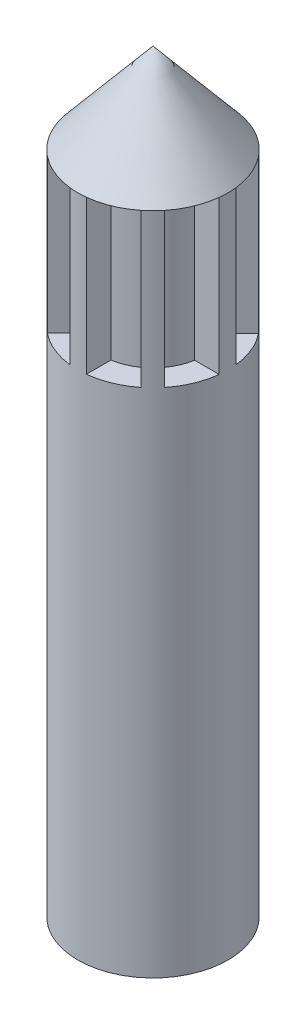
ISO-10303-21;
HEADER;
FILE_DESCRIPTION(('STEP AP214'),'2;1');
FILE_NAME('part.step','',(''),(''),'','','');
FILE_SCHEMA(('AUTOMOTIVE_DESIGN { 1 0 10303 214 1 1 1 1 }'));
ENDSEC;
DATA;
#1=APPLICATION_CONTEXT('core data for automotive mechanical design processes');
#2=APPLICATION_PROTOCOL_DEFINITION('international standard','automotive_design',2000,#1);
#3=PRODUCT_CONTEXT('',#1,'mechanical');
#4=PRODUCT('Part','Part','',(#3));
#5=PRODUCT_RELATED_PRODUCT_CATEGORY('part','',(#4));
#6=PRODUCT_DEFINITION_FORMATION('','',#4);
#7=PRODUCT_DEFINITION_CONTEXT('part definition',#1,'design');
#8=PRODUCT_DEFINITION('design','',#6,#7);
#9=PRODUCT_DEFINITION_SHAPE('','',#8);
#10=(LENGTH_UNIT() NAMED_UNIT(*) SI_UNIT(.MILLI.,.METRE.));
#11=(NAMED_UNIT(*) PLANE_ANGLE_UNIT() SI_UNIT($,.RADIAN.));
#12=(NAMED_UNIT(*) SI_UNIT($,.STERADIAN.) SOLID_ANGLE_UNIT());
#13=UNCERTAINTY_MEASURE_WITH_UNIT(LENGTH_MEASURE(1.E-05),#10,'distance_accuracy_value','');
#14=(GEOMETRIC_REPRESENTATION_CONTEXT(3) GLOBAL_UNCERTAINTY_ASSIGNED_CONTEXT((#13)) GLOBAL_UNIT_ASSIGNED_CONTEXT((#10,
#11,#12)) REPRESENTATION_CONTEXT('',''));
#15=CARTESIAN_POINT('',(0.,0.,0.));
#16=DIRECTION('',(0.,0.,1.));
#17=DIRECTION('',(1.,0.,0.));
#18=AXIS2_PLACEMENT_3D('',#15,#16,#17);
#19=CARTESIAN_POINT('',(0.375265840517225,7.5,0.));
#20=DIRECTION('',(0.,-1.,0.));
#21=DIRECTION('',(0.,0.,-1.));
#22=AXIS2_PLACEMENT_3D('',#19,#20,#21);
#23=CYLINDRICAL_SURFACE('',#22,4.96884550887098);
#24=CARTESIAN_POINT('',(0.375265840517225,-7.5,0.));
#25=DIRECTION('',(0.,1.,0.));
#26=DIRECTION('',(0.,0.,1.));
#27=AXIS2_PLACEMENT_3D('',#24,#25,#26);
#28=CIRCLE('',#27,4.96884550887098);
#29=CARTESIAN_POINT('',(1.16634573988688,-7.5,4.90546820230655));
#30=VERTEX_POINT('',#29);
#31=CARTESIAN_POINT('',(3.25724016380198,-7.5,4.04767213234406));
#32=VERTEX_POINT('',#31);
#33=EDGE_CURVE('E282',#30,#32,#28,.T.);
#34=ORIENTED_EDGE('',*,*,#33,.T.);
#35=DIRECTION('',(0.,-1.,0.));
#36=VECTOR('',#35,1.);
#37=CARTESIAN_POINT('',(3.25724016380191,7.5,4.04767213234396));
#38=LINE('',#37,#36);
#39=CARTESIAN_POINT('',(3.25724016380191,7.5,4.04767213234396));
#40=VERTEX_POINT('',#39);
#41=EDGE_CURVE('E11',#40,#32,#38,.T.);
#42=ORIENTED_EDGE('',*,*,#41,.F.);
#43=CARTESIAN_POINT('',(0.375265840517225,7.5,0.));
#44=DIRECTION('',(0.,1.,0.));
#45=DIRECTION('',(0.,0.,1.));
#46=AXIS2_PLACEMENT_3D('',#43,#44,#45);
#47=CIRCLE('',#46,4.96884550887098);
#48=CARTESIAN_POINT('',(1.16634573988688,7.5,4.90546820230655));
#49=VERTEX_POINT('',#48);
#50=EDGE_CURVE('E346',#49,#40,#47,.T.);
#51=ORIENTED_EDGE('',*,*,#50,.F.);
#52=DIRECTION('',(0.,-1.,0.));
#53=VECTOR('',#52,1.);
#54=CARTESIAN_POINT('',(1.16634573988688,7.5,4.90546820230655));
#55=LINE('',#54,#53);
#56=EDGE_CURVE('E62',#49,#30,#55,.T.);
#57=ORIENTED_EDGE('',*,*,#56,.T.);
#58=EDGE_LOOP('',(#34,#42,#51,#57));
#59=FACE_BOUND('',#58,.T.);
#60=ADVANCED_FACE('F45',(#59),#23,.T.);
#61=CARTESIAN_POINT('',(-0.395215984271011,7.5,0.395215984271011));
#62=DIRECTION('',(-0.707106781186547,0.,0.707106781186548));
#63=DIRECTION('',(0.707106781186548,0.,0.707106781186547));
#64=AXIS2_PLACEMENT_3D('',#61,#62,#63);
#65=PLANE('',#64);
#66=DIRECTION('',(-0.707106781186548,0.,-0.707106781186547));
#67=VECTOR('',#66,1.);
#68=CARTESIAN_POINT('',(-0.395215984271011,-7.5,0.395215984271011));
#69=LINE('',#68,#67);
#70=CARTESIAN_POINT('',(4.95686629235549,-7.5,5.7472982608975));
#71=VERTEX_POINT('',#70);
#72=EDGE_CURVE('E258',#71,#32,#69,.T.);
#73=ORIENTED_EDGE('',*,*,#72,.F.);
#74=DIRECTION('',(0.,-1.,0.));
#75=VECTOR('',#74,1.);
#76=CARTESIAN_POINT('',(4.95686629235556,7.5,5.74729826089758));
#77=LINE('',#76,#75);
#78=CARTESIAN_POINT('',(4.95686629235556,7.5,5.74729826089758));
#79=VERTEX_POINT('',#78);
#80=EDGE_CURVE('E55',#79,#71,#77,.T.);
#81=ORIENTED_EDGE('',*,*,#80,.F.);
#82=DIRECTION('',(-0.707106781186548,0.,-0.707106781186547));
#83=VECTOR('',#82,1.);
#84=CARTESIAN_POINT('',(-0.395215984271011,7.5,0.395215984271011));
#85=LINE('',#84,#83);
#86=EDGE_CURVE('E486',#79,#40,#85,.T.);
#87=ORIENTED_EDGE('',*,*,#86,.T.);
#88=ORIENTED_EDGE('',*,*,#41,.T.);
#89=EDGE_LOOP('',(#73,#81,#87,#88));
#90=FACE_BOUND('',#89,.T.);
#91=ADVANCED_FACE('F47',(#90),#65,.T.);
#92=CARTESIAN_POINT('',(0.747010881563202,7.5,-0.747010881563202));
#93=DIRECTION('',(-0.707106781186547,0.,0.707106781186547));
#94=DIRECTION('',(0.707106781186548,0.,0.707106781186548));
#95=AXIS2_PLACEMENT_3D('',#92,#93,#94);
#96=PLANE('',#95);
#97=DIRECTION('',(-0.707106781186548,0.,-0.707106781186548));
#98=VECTOR('',#97,1.);
#99=CARTESIAN_POINT('',(0.747010881563202,-7.5,-0.747010881563202));
#100=LINE('',#99,#98);
#101=CARTESIAN_POINT('',(6.10168805326835,-7.5,4.60766629014195));
#102=VERTEX_POINT('',#101);
#103=CARTESIAN_POINT('',(4.40333363256777,-7.5,2.90931186944136));
#104=VERTEX_POINT('',#103);
#105=EDGE_CURVE('E281',#102,#104,#100,.T.);
#106=ORIENTED_EDGE('',*,*,#105,.T.);
#107=DIRECTION('',(0.,-1.,0.));
#108=VECTOR('',#107,1.);
#109=CARTESIAN_POINT('',(4.40333363256777,7.5,2.90931186944136));
#110=LINE('',#109,#108);
#111=CARTESIAN_POINT('',(4.40333363256777,7.5,2.90931186944136));
#112=VERTEX_POINT('',#111);
#113=EDGE_CURVE('E456',#112,#104,#110,.T.);
#114=ORIENTED_EDGE('',*,*,#113,.F.);
#115=DIRECTION('',(-0.707106781186548,0.,-0.707106781186548));
#116=VECTOR('',#115,1.);
#117=CARTESIAN_POINT('',(0.747010881563202,7.5,-0.747010881563202));
#118=LINE('',#117,#116);
#119=CARTESIAN_POINT('',(6.10168805326857,7.5,4.60766629014217));
#120=VERTEX_POINT('',#119);
#121=EDGE_CURVE('E466',#120,#112,#118,.T.);
#122=ORIENTED_EDGE('',*,*,#121,.F.);
#123=DIRECTION('',(0.,-1.,0.));
#124=VECTOR('',#123,1.);
#125=CARTESIAN_POINT('',(6.10168805326857,7.5,4.60766629014217));
#126=LINE('',#125,#124);
#127=EDGE_CURVE('E278',#120,#102,#126,.T.);
#128=ORIENTED_EDGE('',*,*,#127,.T.);
#129=EDGE_LOOP('',(#106,#114,#122,#128));
#130=FACE_BOUND('',#129,.T.);
#131=ADVANCED_FACE('F464',(#130),#96,.F.);
#132=CARTESIAN_POINT('',(5.27526584051764,-7.5,0.824272825600417));
#133=VERTEX_POINT('',#132);
#134=EDGE_CURVE('E287',#104,#133,#28,.T.);
#135=ORIENTED_EDGE('',*,*,#134,.T.);
#136=DIRECTION('',(0.,-1.,0.));
#137=VECTOR('',#136,1.);
#138=CARTESIAN_POINT('',(5.27526584051764,7.5,0.824272825600417));
#139=LINE('',#138,#137);
#140=CARTESIAN_POINT('',(5.27526584051764,7.5,0.824272825600417));
#141=VERTEX_POINT('',#140);
#142=EDGE_CURVE('E452',#141,#133,#139,.T.);
#143=ORIENTED_EDGE('',*,*,#142,.F.);
#144=EDGE_CURVE('E488',#112,#141,#47,.T.);
#145=ORIENTED_EDGE('',*,*,#144,.F.);
#146=ORIENTED_EDGE('',*,*,#113,.T.);
#147=EDGE_LOOP('',(#135,#143,#145,#146));
#148=FACE_BOUND('',#147,.T.);
#149=ADVANCED_FACE('F617',(#148),#23,.T.);
#150=CARTESIAN_POINT('',(0.,7.5,0.824272825600418));
#151=DIRECTION('',(0.,0.,1.));
#152=DIRECTION('',(1.,0.,0.));
#153=AXIS2_PLACEMENT_3D('',#150,#151,#152);
#154=PLANE('',#153);
#155=DIRECTION('',(-1.,0.,0.));
#156=VECTOR('',#155,1.);
#157=CARTESIAN_POINT('',(0.,-7.5,0.824272825600418));
#158=LINE('',#157,#156);
#159=CARTESIAN_POINT('',(7.67890016248165,-7.5,0.824272825600378));
#160=VERTEX_POINT('',#159);
#161=EDGE_CURVE('E294',#160,#133,#158,.T.);
#162=ORIENTED_EDGE('',*,*,#161,.F.);
#163=DIRECTION('',(0.,-1.,0.));
#164=VECTOR('',#163,1.);
#165=CARTESIAN_POINT('',(7.67890016248199,7.5,0.824272825600417));
#166=LINE('',#165,#164);
#167=CARTESIAN_POINT('',(7.67890016248199,7.5,0.824272825600417));
#168=VERTEX_POINT('',#167);
#169=EDGE_CURVE('E448',#168,#160,#166,.T.);
#170=ORIENTED_EDGE('',*,*,#169,.F.);
#171=DIRECTION('',(-1.,0.,0.));
#172=VECTOR('',#171,1.);
#173=CARTESIAN_POINT('',(0.,7.5,0.824272825600418));
#174=LINE('',#173,#172);
#175=EDGE_CURVE('E495',#168,#141,#174,.T.);
#176=ORIENTED_EDGE('',*,*,#175,.T.);
#177=ORIENTED_EDGE('',*,*,#142,.T.);
#178=EDGE_LOOP('',(#162,#170,#176,#177));
#179=FACE_BOUND('',#178,.T.);
#180=ADVANCED_FACE('F625',(#179),#154,.T.);
#181=CARTESIAN_POINT('',(0.,7.5,-0.791079899369239));
#182=DIRECTION('',(0.,0.,1.));
#183=DIRECTION('',(1.,0.,0.));
#184=AXIS2_PLACEMENT_3D('',#181,#182,#183);
#185=PLANE('',#184);
#186=DIRECTION('',(-1.,0.,0.));
#187=VECTOR('',#186,1.);
#188=CARTESIAN_POINT('',(0.,-7.5,-0.791079899369239));
#189=LINE('',#188,#187);
#190=CARTESIAN_POINT('',(7.68256989829489,-7.5,-0.791079899369241));
#191=VERTEX_POINT('',#190);
#192=CARTESIAN_POINT('',(5.28073404282384,-7.5,-0.79107989936924));
#193=VERTEX_POINT('',#192);
#194=EDGE_CURVE('E297',#191,#193,#189,.T.);
#195=ORIENTED_EDGE('',*,*,#194,.T.);
#196=DIRECTION('',(0.,-1.,0.));
#197=VECTOR('',#196,1.);
#198=CARTESIAN_POINT('',(5.28073404282384,7.5,-0.79107989936924));
#199=LINE('',#198,#197);
#200=CARTESIAN_POINT('',(5.28073404282384,7.5,-0.79107989936924));
#201=VERTEX_POINT('',#200);
#202=EDGE_CURVE('E440',#201,#193,#199,.T.);
#203=ORIENTED_EDGE('',*,*,#202,.F.);
#204=DIRECTION('',(-1.,0.,0.));
#205=VECTOR('',#204,1.);
#206=CARTESIAN_POINT('',(0.,7.5,-0.791079899369239));
#207=LINE('',#206,#205);
#208=CARTESIAN_POINT('',(7.68256989829536,7.5,-0.791079899369241));
#209=VERTEX_POINT('',#208);
#210=EDGE_CURVE('E503',#209,#201,#207,.T.);
#211=ORIENTED_EDGE('',*,*,#210,.F.);
#212=DIRECTION('',(0.,-1.,0.));
#213=VECTOR('',#212,1.);
#214=CARTESIAN_POINT('',(7.68256989829536,7.5,-0.791079899369241));
#215=LINE('',#214,#213);
#216=EDGE_CURVE('E444',#209,#191,#215,.T.);
#217=ORIENTED_EDGE('',*,*,#216,.T.);
#218=EDGE_LOOP('',(#195,#203,#211,#217));
#219=FACE_BOUND('',#218,.T.);
#220=ADVANCED_FACE('F697',(#219),#185,.F.);
#221=CARTESIAN_POINT('',(4.42293797286165,-7.5,-2.8819743232842));
#222=VERTEX_POINT('',#221);
#223=EDGE_CURVE('E301',#193,#222,#28,.T.);
#224=ORIENTED_EDGE('',*,*,#223,.T.);
#225=DIRECTION('',(0.,-1.,0.));
#226=VECTOR('',#225,1.);
#227=CARTESIAN_POINT('',(4.42293797286166,7.5,-2.88197432328421));
#228=LINE('',#227,#226);
#229=CARTESIAN_POINT('',(4.42293797286166,7.5,-2.88197432328421));
#230=VERTEX_POINT('',#229);
#231=EDGE_CURVE('E436',#230,#222,#228,.T.);
#232=ORIENTED_EDGE('',*,*,#231,.F.);
#233=EDGE_CURVE('E507',#201,#230,#47,.T.);
#234=ORIENTED_EDGE('',*,*,#233,.F.);
#235=ORIENTED_EDGE('',*,*,#202,.T.);
#236=EDGE_LOOP('',(#224,#232,#234,#235));
#237=FACE_BOUND('',#236,.T.);
#238=ADVANCED_FACE('F627',(#237),#23,.T.);
#239=CARTESIAN_POINT('',(0.770481824788723,7.5,0.770481824788723));
#240=DIRECTION('',(0.707106781186547,0.,0.707106781186548));
#241=DIRECTION('',(0.707106781186548,0.,-0.707106781186547));
#242=AXIS2_PLACEMENT_3D('',#239,#240,#241);
#243=PLANE('',#242);
#244=DIRECTION('',(-0.707106781186548,0.,0.707106781186547));
#245=VECTOR('',#244,1.);
#246=CARTESIAN_POINT('',(0.770481824788723,-7.5,0.770481824788723));
#247=LINE('',#246,#245);
#248=CARTESIAN_POINT('',(6.12256410141514,-7.5,-4.58160045183774));
#249=VERTEX_POINT('',#248);
#250=EDGE_CURVE('E302',#249,#222,#247,.T.);
#251=ORIENTED_EDGE('',*,*,#250,.F.);
#252=DIRECTION('',(0.,-1.,0.));
#253=VECTOR('',#252,1.);
#254=CARTESIAN_POINT('',(6.12256410141537,7.5,-4.58160045183793));
#255=LINE('',#254,#253);
#256=CARTESIAN_POINT('',(6.12256410141537,7.5,-4.58160045183793));
#257=VERTEX_POINT('',#256);
#258=EDGE_CURVE('E432',#257,#249,#255,.T.);
#259=ORIENTED_EDGE('',*,*,#258,.F.);
#260=DIRECTION('',(-0.707106781186548,0.,0.707106781186547));
#261=VECTOR('',#260,1.);
#262=CARTESIAN_POINT('',(0.770481824788723,7.5,0.770481824788723));
#263=LINE('',#262,#261);
#264=EDGE_CURVE('E508',#257,#230,#263,.T.);
#265=ORIENTED_EDGE('',*,*,#264,.T.);
#266=ORIENTED_EDGE('',*,*,#231,.T.);
#267=EDGE_LOOP('',(#251,#259,#265,#266));
#268=FACE_BOUND('',#267,.T.);
#269=ADVANCED_FACE('F692',(#268),#243,.T.);
#270=CARTESIAN_POINT('',(-0.371745041045491,7.5,-0.371745041045491));
#271=DIRECTION('',(0.707106781186547,0.,0.707106781186548));
#272=DIRECTION('',(0.707106781186548,0.,-0.707106781186547));
#273=AXIS2_PLACEMENT_3D('',#270,#271,#272);
#274=PLANE('',#273);
#275=DIRECTION('',(-0.707106781186548,0.,0.707106781186547));
#276=VECTOR('',#275,1.);
#277=CARTESIAN_POINT('',(-0.371745041045491,-7.5,-0.371745041045491));
#278=LINE('',#277,#276);
#279=CARTESIAN_POINT('',(4.98293213065971,-7.5,-5.72642221275069));
#280=VERTEX_POINT('',#279);
#281=CARTESIAN_POINT('',(3.28457770995915,-7.5,-4.02806779205013));
#282=VERTEX_POINT('',#281);
#283=EDGE_CURVE('E305',#280,#282,#278,.T.);
#284=ORIENTED_EDGE('',*,*,#283,.T.);
#285=DIRECTION('',(0.,-1.,0.));
#286=VECTOR('',#285,1.);
#287=CARTESIAN_POINT('',(3.28457770995915,7.5,-4.02806779205013));
#288=LINE('',#287,#286);
#289=CARTESIAN_POINT('',(3.28457770995915,7.5,-4.02806779205013));
#290=VERTEX_POINT('',#289);
#291=EDGE_CURVE('E424',#290,#282,#288,.T.);
#292=ORIENTED_EDGE('',*,*,#291,.F.);
#293=DIRECTION('',(-0.707106781186548,0.,0.707106781186547));
#294=VECTOR('',#293,1.);
#295=CARTESIAN_POINT('',(-0.371745041045491,7.5,-0.371745041045491));
#296=LINE('',#295,#294);
#297=CARTESIAN_POINT('',(4.98293213065996,7.5,-5.72642221275094));
#298=VERTEX_POINT('',#297);
#299=EDGE_CURVE('E516',#298,#290,#296,.T.);
#300=ORIENTED_EDGE('',*,*,#299,.F.);
#301=DIRECTION('',(0.,-1.,0.));
#302=VECTOR('',#301,1.);
#303=CARTESIAN_POINT('',(4.98293213065996,7.5,-5.72642221275094));
#304=LINE('',#303,#302);
#305=EDGE_CURVE('E428',#298,#280,#304,.T.);
#306=ORIENTED_EDGE('',*,*,#305,.T.);
#307=EDGE_LOOP('',(#284,#292,#300,#306));
#308=FACE_BOUND('',#307,.T.);
#309=ADVANCED_FACE('F684',(#308),#274,.F.);
#310=CARTESIAN_POINT('',(1.1995386661182,-7.5,-4.9));
#311=VERTEX_POINT('',#310);
#312=EDGE_CURVE('E309',#282,#311,#28,.T.);
#313=ORIENTED_EDGE('',*,*,#312,.T.);
#314=DIRECTION('',(0.,-1.,0.));
#315=VECTOR('',#314,1.);
#316=CARTESIAN_POINT('',(1.19953866611823,7.5,-4.90000000000015));
#317=LINE('',#316,#315);
#318=CARTESIAN_POINT('',(1.19953866611823,7.5,-4.90000000000015));
#319=VERTEX_POINT('',#318);
#320=EDGE_CURVE('E420',#319,#311,#317,.T.);
#321=ORIENTED_EDGE('',*,*,#320,.F.);
#322=EDGE_CURVE('E520',#290,#319,#47,.T.);
#323=ORIENTED_EDGE('',*,*,#322,.F.);
#324=ORIENTED_EDGE('',*,*,#291,.T.);
#325=EDGE_LOOP('',(#313,#321,#323,#324));
#326=FACE_BOUND('',#325,.T.);
#327=ADVANCED_FACE('F672',(#326),#23,.T.);
#328=CARTESIAN_POINT('',(1.19953866611821,7.5,0.));
#329=DIRECTION('',(1.,0.,0.));
#330=DIRECTION('',(0.,0.,-1.));
#331=AXIS2_PLACEMENT_3D('',#328,#329,#330);
#332=PLANE('',#331);
#333=DIRECTION('',(0.,0.,1.));
#334=VECTOR('',#333,1.);
#335=CARTESIAN_POINT('',(1.19953866611821,-7.5,0.));
#336=LINE('',#335,#334);
#337=CARTESIAN_POINT('',(1.1995386661182,-7.5,-7.30363432196436));
#338=VERTEX_POINT('',#337);
#339=EDGE_CURVE('E310',#338,#311,#336,.T.);
#340=ORIENTED_EDGE('',*,*,#339,.F.);
#341=DIRECTION('',(0.,-1.,0.));
#342=VECTOR('',#341,1.);
#343=CARTESIAN_POINT('',(1.1995386661182,7.5,-7.30363432196436));
#344=LINE('',#343,#342);
#345=CARTESIAN_POINT('',(1.1995386661182,7.5,-7.30363432196436));
#346=VERTEX_POINT('',#345);
#347=EDGE_CURVE('E416',#346,#338,#344,.T.);
#348=ORIENTED_EDGE('',*,*,#347,.F.);
#349=DIRECTION('',(0.,0.,1.));
#350=VECTOR('',#349,1.);
#351=CARTESIAN_POINT('',(1.19953866611821,7.5,0.));
#352=LINE('',#351,#350);
#353=EDGE_CURVE('E521',#346,#319,#352,.T.);
#354=ORIENTED_EDGE('',*,*,#353,.T.);
#355=ORIENTED_EDGE('',*,*,#320,.T.);
#356=EDGE_LOOP('',(#340,#348,#354,#355));
#357=FACE_BOUND('',#356,.T.);
#358=ADVANCED_FACE('F679',(#357),#332,.T.);
#359=CARTESIAN_POINT('',(-0.415814058851452,7.5,0.));
#360=DIRECTION('',(1.,0.,0.));
#361=DIRECTION('',(0.,0.,-1.));
#362=AXIS2_PLACEMENT_3D('',#359,#360,#361);
#363=PLANE('',#362);
#364=DIRECTION('',(0.,0.,1.));
#365=VECTOR('',#364,1.);
#366=CARTESIAN_POINT('',(-0.415814058851452,-7.5,0.));
#367=LINE('',#366,#365);
#368=CARTESIAN_POINT('',(-0.415814058851453,-7.5,-7.30730405777773));
#369=VERTEX_POINT('',#368);
#370=CARTESIAN_POINT('',(-0.415814058851453,-7.5,-4.9054682023067));
#371=VERTEX_POINT('',#370);
#372=EDGE_CURVE('E313',#369,#371,#367,.T.);
#373=ORIENTED_EDGE('',*,*,#372,.T.);
#374=DIRECTION('',(0.,-1.,0.));
#375=VECTOR('',#374,1.);
#376=CARTESIAN_POINT('',(-0.415814058851453,7.5,-4.9054682023067));
#377=LINE('',#376,#375);
#378=CARTESIAN_POINT('',(-0.415814058851453,7.5,-4.9054682023067));
#379=VERTEX_POINT('',#378);
#380=EDGE_CURVE('E408',#379,#371,#377,.T.);
#381=ORIENTED_EDGE('',*,*,#380,.F.);
#382=DIRECTION('',(0.,0.,1.));
#383=VECTOR('',#382,1.);
#384=CARTESIAN_POINT('',(-0.415814058851452,7.5,0.));
#385=LINE('',#384,#383);
#386=CARTESIAN_POINT('',(-0.415814058851453,7.5,-7.30730405777773));
#387=VERTEX_POINT('',#386);
#388=EDGE_CURVE('E529',#387,#379,#385,.T.);
#389=ORIENTED_EDGE('',*,*,#388,.F.);
#390=DIRECTION('',(0.,-1.,0.));
#391=VECTOR('',#390,1.);
#392=CARTESIAN_POINT('',(-0.415814058851453,7.5,-7.30730405777773));
#393=LINE('',#392,#391);
#394=EDGE_CURVE('E412',#387,#369,#393,.T.);
#395=ORIENTED_EDGE('',*,*,#394,.T.);
#396=EDGE_LOOP('',(#373,#381,#389,#395));
#397=FACE_BOUND('',#396,.T.);
#398=ADVANCED_FACE('F670',(#397),#363,.F.);
#399=CARTESIAN_POINT('',(-2.50670848276641,-7.5,-4.04767213234401));
#400=VERTEX_POINT('',#399);
#401=EDGE_CURVE('E317',#371,#400,#28,.T.);
#402=ORIENTED_EDGE('',*,*,#401,.T.);
#403=DIRECTION('',(0.,-1.,0.));
#404=VECTOR('',#403,1.);
#405=CARTESIAN_POINT('',(-2.50670848276661,7.5,-4.04767213234429));
#406=LINE('',#405,#404);
#407=CARTESIAN_POINT('',(-2.50670848276661,7.5,-4.04767213234429));
#408=VERTEX_POINT('',#407);
#409=EDGE_CURVE('E404',#408,#400,#406,.T.);
#410=ORIENTED_EDGE('',*,*,#409,.F.);
#411=EDGE_CURVE('E533',#379,#408,#47,.T.);
#412=ORIENTED_EDGE('',*,*,#411,.F.);
#413=ORIENTED_EDGE('',*,*,#380,.T.);
#414=EDGE_LOOP('',(#402,#410,#412,#413));
#415=FACE_BOUND('',#414,.T.);
#416=ADVANCED_FACE('F658',(#415),#23,.T.);
#417=CARTESIAN_POINT('',(0.770481824788799,7.5,-0.770481824788799));
#418=DIRECTION('',(0.707106781186547,0.,-0.707106781186548));
#419=DIRECTION('',(-0.707106781186548,0.,-0.707106781186547));
#420=AXIS2_PLACEMENT_3D('',#417,#418,#419);
#421=PLANE('',#420);
#422=DIRECTION('',(0.707106781186548,0.,0.707106781186547));
#423=VECTOR('',#422,1.);
#424=CARTESIAN_POINT('',(0.770481824788799,-7.5,-0.770481824788799));
#425=LINE('',#424,#423);
#426=CARTESIAN_POINT('',(-4.20633461132037,-7.5,-5.74729826089803));
#427=VERTEX_POINT('',#426);
#428=EDGE_CURVE('E318',#427,#400,#425,.T.);
#429=ORIENTED_EDGE('',*,*,#428,.F.);
#430=DIRECTION('',(0.,-1.,0.));
#431=VECTOR('',#430,1.);
#432=CARTESIAN_POINT('',(-4.20633461132014,7.5,-5.74729826089774));
#433=LINE('',#432,#431);
#434=CARTESIAN_POINT('',(-4.20633461132014,7.5,-5.74729826089774));
#435=VERTEX_POINT('',#434);
#436=EDGE_CURVE('E400',#435,#427,#433,.T.);
#437=ORIENTED_EDGE('',*,*,#436,.F.);
#438=DIRECTION('',(0.707106781186548,0.,0.707106781186547));
#439=VECTOR('',#438,1.);
#440=CARTESIAN_POINT('',(0.770481824788799,7.5,-0.770481824788799));
#441=LINE('',#440,#439);
#442=EDGE_CURVE('E534',#435,#408,#441,.T.);
#443=ORIENTED_EDGE('',*,*,#442,.T.);
#444=ORIENTED_EDGE('',*,*,#409,.T.);
#445=EDGE_LOOP('',(#429,#437,#443,#444));
#446=FACE_BOUND('',#445,.T.);
#447=ADVANCED_FACE('F665',(#446),#421,.T.);
#448=CARTESIAN_POINT('',(-0.371745041045416,7.5,0.371745041045416));
#449=DIRECTION('',(0.707106781186548,0.,-0.707106781186547));
#450=DIRECTION('',(-0.707106781186547,0.,-0.707106781186548));
#451=AXIS2_PLACEMENT_3D('',#448,#449,#450);
#452=PLANE('',#451);
#453=DIRECTION('',(0.707106781186547,0.,0.707106781186548));
#454=VECTOR('',#453,1.);
#455=CARTESIAN_POINT('',(-0.371745041045416,-7.5,0.371745041045416));
#456=LINE('',#455,#454);
#457=CARTESIAN_POINT('',(-5.3511563722334,-7.5,-4.60766629014257));
#458=VERTEX_POINT('',#457);
#459=CARTESIAN_POINT('',(-3.65280195153285,-7.5,-2.90931186944202));
#460=VERTEX_POINT('',#459);
#461=EDGE_CURVE('E321',#458,#460,#456,.T.);
#462=ORIENTED_EDGE('',*,*,#461,.T.);
#463=DIRECTION('',(0.,-1.,0.));
#464=VECTOR('',#463,1.);
#465=CARTESIAN_POINT('',(-3.65280195153285,7.5,-2.90931186944202));
#466=LINE('',#465,#464);
#467=CARTESIAN_POINT('',(-3.65280195153285,7.5,-2.90931186944202));
#468=VERTEX_POINT('',#467);
#469=EDGE_CURVE('E392',#468,#460,#466,.T.);
#470=ORIENTED_EDGE('',*,*,#469,.F.);
#471=DIRECTION('',(0.707106781186547,0.,0.707106781186548));
#472=VECTOR('',#471,1.);
#473=CARTESIAN_POINT('',(-0.371745041045416,7.5,0.371745041045416));
#474=LINE('',#473,#472);
#475=CARTESIAN_POINT('',(-5.35115637223315,7.5,-4.60766629014232));
#476=VERTEX_POINT('',#475);
#477=EDGE_CURVE('E542',#476,#468,#474,.T.);
#478=ORIENTED_EDGE('',*,*,#477,.F.);
#479=DIRECTION('',(0.,-1.,0.));
#480=VECTOR('',#479,1.);
#481=CARTESIAN_POINT('',(-5.35115637223315,7.5,-4.60766629014232));
#482=LINE('',#481,#480);
#483=EDGE_CURVE('E396',#476,#458,#482,.T.);
#484=ORIENTED_EDGE('',*,*,#483,.T.);
#485=EDGE_LOOP('',(#462,#470,#478,#484));
#486=FACE_BOUND('',#485,.T.);
#487=ADVANCED_FACE('F656',(#486),#452,.F.);
#488=CARTESIAN_POINT('',(-4.52473415948221,-7.5,-0.824272825600568));
#489=VERTEX_POINT('',#488);
#490=EDGE_CURVE('E325',#460,#489,#28,.T.);
#491=ORIENTED_EDGE('',*,*,#490,.T.);
#492=DIRECTION('',(0.,-1.,0.));
#493=VECTOR('',#492,1.);
#494=CARTESIAN_POINT('',(-4.52473415948267,7.5,-0.824272825600646));
#495=LINE('',#494,#493);
#496=CARTESIAN_POINT('',(-4.52473415948267,7.5,-0.824272825600646));
#497=VERTEX_POINT('',#496);
#498=EDGE_CURVE('E388',#497,#489,#495,.T.);
#499=ORIENTED_EDGE('',*,*,#498,.F.);
#500=EDGE_CURVE('E546',#468,#497,#47,.T.);
#501=ORIENTED_EDGE('',*,*,#500,.F.);
#502=ORIENTED_EDGE('',*,*,#469,.T.);
#503=EDGE_LOOP('',(#491,#499,#501,#502));
#504=FACE_BOUND('',#503,.T.);
#505=ADVANCED_FACE('F644',(#504),#23,.T.);
#506=CARTESIAN_POINT('',(0.,7.5,-0.824272825600569));
#507=DIRECTION('',(0.,0.,-1.));
#508=DIRECTION('',(-1.,0.,0.));
#509=AXIS2_PLACEMENT_3D('',#506,#507,#508);
#510=PLANE('',#509);
#511=DIRECTION('',(1.,0.,0.));
#512=VECTOR('',#511,1.);
#513=CARTESIAN_POINT('',(0.,-7.5,-0.824272825600569));
#514=LINE('',#513,#512);
#515=CARTESIAN_POINT('',(-6.92836848144717,-7.5,-0.824272825600635));
#516=VERTEX_POINT('',#515);
#517=EDGE_CURVE('E326',#516,#489,#514,.T.);
#518=ORIENTED_EDGE('',*,*,#517,.F.);
#519=DIRECTION('',(0.,-1.,0.));
#520=VECTOR('',#519,1.);
#521=CARTESIAN_POINT('',(-6.92836848144657,7.5,-0.824272825600567));
#522=LINE('',#521,#520);
#523=CARTESIAN_POINT('',(-6.92836848144657,7.5,-0.824272825600567));
#524=VERTEX_POINT('',#523);
#525=EDGE_CURVE('E384',#524,#516,#522,.T.);
#526=ORIENTED_EDGE('',*,*,#525,.F.);
#527=DIRECTION('',(1.,0.,0.));
#528=VECTOR('',#527,1.);
#529=CARTESIAN_POINT('',(0.,7.5,-0.824272825600569));
#530=LINE('',#529,#528);
#531=EDGE_CURVE('E547',#524,#497,#530,.T.);
#532=ORIENTED_EDGE('',*,*,#531,.T.);
#533=ORIENTED_EDGE('',*,*,#498,.T.);
#534=EDGE_LOOP('',(#518,#526,#532,#533));
#535=FACE_BOUND('',#534,.T.);
#536=ADVANCED_FACE('F651',(#535),#510,.T.);
#537=CARTESIAN_POINT('',(0.,7.5,0.791079899369088));
#538=DIRECTION('',(0.,0.,-1.));
#539=DIRECTION('',(-1.,0.,0.));
#540=AXIS2_PLACEMENT_3D('',#537,#538,#539);
#541=PLANE('',#540);
#542=DIRECTION('',(1.,0.,0.));
#543=VECTOR('',#542,1.);
#544=CARTESIAN_POINT('',(0.,-7.5,0.791079899369088));
#545=LINE('',#544,#543);
#546=CARTESIAN_POINT('',(-6.93203821726046,-7.5,0.791079899369091));
#547=VERTEX_POINT('',#546);
#548=CARTESIAN_POINT('',(-4.53020236178941,-7.5,0.79107989936909));
#549=VERTEX_POINT('',#548);
#550=EDGE_CURVE('E329',#547,#549,#545,.T.);
#551=ORIENTED_EDGE('',*,*,#550,.T.);
#552=DIRECTION('',(0.,-1.,0.));
#553=VECTOR('',#552,1.);
#554=CARTESIAN_POINT('',(-4.53020236178941,7.5,0.79107989936909));
#555=LINE('',#554,#553);
#556=CARTESIAN_POINT('',(-4.53020236178941,7.5,0.79107989936909));
#557=VERTEX_POINT('',#556);
#558=EDGE_CURVE('E376',#557,#549,#555,.T.);
#559=ORIENTED_EDGE('',*,*,#558,.F.);
#560=DIRECTION('',(1.,0.,0.));
#561=VECTOR('',#560,1.);
#562=CARTESIAN_POINT('',(0.,7.5,0.791079899369088));
#563=LINE('',#562,#561);
#564=CARTESIAN_POINT('',(-6.93203821725994,7.5,0.791079899369091));
#565=VERTEX_POINT('',#564);
#566=EDGE_CURVE('E555',#565,#557,#563,.T.);
#567=ORIENTED_EDGE('',*,*,#566,.F.);
#568=DIRECTION('',(0.,-1.,0.));
#569=VECTOR('',#568,1.);
#570=CARTESIAN_POINT('',(-6.93203821725994,7.5,0.791079899369091));
#571=LINE('',#570,#569);
#572=EDGE_CURVE('E380',#565,#547,#571,.T.);
#573=ORIENTED_EDGE('',*,*,#572,.T.);
#574=EDGE_LOOP('',(#551,#559,#567,#573));
#575=FACE_BOUND('',#574,.T.);
#576=ADVANCED_FACE('F642',(#575),#541,.F.);
#577=CARTESIAN_POINT('',(-3.67240629182622,-7.5,2.88197432328405));
#578=VERTEX_POINT('',#577);
#579=EDGE_CURVE('E333',#549,#578,#28,.T.);
#580=ORIENTED_EDGE('',*,*,#579,.T.);
#581=DIRECTION('',(0.,-1.,0.));
#582=VECTOR('',#581,1.);
#583=CARTESIAN_POINT('',(-3.67240629182659,7.5,2.88197432328431));
#584=LINE('',#583,#582);
#585=CARTESIAN_POINT('',(-3.67240629182659,7.5,2.88197432328431));
#586=VERTEX_POINT('',#585);
#587=EDGE_CURVE('E372',#586,#578,#584,.T.);
#588=ORIENTED_EDGE('',*,*,#587,.F.);
#589=EDGE_CURVE('E559',#557,#586,#47,.T.);
#590=ORIENTED_EDGE('',*,*,#589,.F.);
#591=ORIENTED_EDGE('',*,*,#558,.T.);
#592=EDGE_LOOP('',(#580,#588,#590,#591));
#593=FACE_BOUND('',#592,.T.);
#594=ADVANCED_FACE('F632',(#593),#23,.T.);
#595=CARTESIAN_POINT('',(-0.39521598427109,7.5,-0.395215984271089));
#596=DIRECTION('',(-0.707106781186548,0.,-0.707106781186547));
#597=DIRECTION('',(-0.707106781186547,0.,0.707106781186548));
#598=AXIS2_PLACEMENT_3D('',#595,#596,#597);
#599=PLANE('',#598);
#600=DIRECTION('',(0.707106781186547,0.,-0.707106781186548));
#601=VECTOR('',#600,1.);
#602=CARTESIAN_POINT('',(-0.39521598427109,-7.5,-0.395215984271089));
#603=LINE('',#602,#601);
#604=CARTESIAN_POINT('',(-5.37203242038038,-7.5,4.58160045183812));
#605=VERTEX_POINT('',#604);
#606=EDGE_CURVE('E334',#605,#578,#603,.T.);
#607=ORIENTED_EDGE('',*,*,#606,.F.);
#608=DIRECTION('',(0.,-1.,0.));
#609=VECTOR('',#608,1.);
#610=CARTESIAN_POINT('',(-5.37203242037995,7.5,4.58160045183778));
#611=LINE('',#610,#609);
#612=CARTESIAN_POINT('',(-5.37203242037995,7.5,4.58160045183778));
#613=VERTEX_POINT('',#612);
#614=EDGE_CURVE('E368',#613,#605,#611,.T.);
#615=ORIENTED_EDGE('',*,*,#614,.F.);
#616=DIRECTION('',(0.707106781186547,0.,-0.707106781186548));
#617=VECTOR('',#616,1.);
#618=CARTESIAN_POINT('',(-0.39521598427109,7.5,-0.395215984271089));
#619=LINE('',#618,#617);
#620=EDGE_CURVE('E560',#613,#586,#619,.T.);
#621=ORIENTED_EDGE('',*,*,#620,.T.);
#622=ORIENTED_EDGE('',*,*,#587,.T.);
#623=EDGE_LOOP('',(#607,#615,#621,#622));
#624=FACE_BOUND('',#623,.T.);
#625=ADVANCED_FACE('F638',(#624),#599,.T.);
#626=CARTESIAN_POINT('',(0.747010881563126,7.5,0.747010881563126));
#627=DIRECTION('',(-0.707106781186548,0.,-0.707106781186547));
#628=DIRECTION('',(-0.707106781186547,0.,0.707106781186548));
#629=AXIS2_PLACEMENT_3D('',#626,#627,#628);
#630=PLANE('',#629);
#631=DIRECTION('',(0.707106781186547,0.,-0.707106781186548));
#632=VECTOR('',#631,1.);
#633=CARTESIAN_POINT('',(0.747010881563126,-7.5,0.747010881563126));
#634=LINE('',#633,#632);
#635=CARTESIAN_POINT('',(-4.23240044962481,-7.5,5.72642221275106));
#636=VERTEX_POINT('',#635);
#637=CARTESIAN_POINT('',(-2.53404602892423,-7.5,4.02806779205048));
#638=VERTEX_POINT('',#637);
#639=EDGE_CURVE('E337',#636,#638,#634,.T.);
#640=ORIENTED_EDGE('',*,*,#639,.T.);
#641=DIRECTION('',(0.,-1.,0.));
#642=VECTOR('',#641,1.);
#643=CARTESIAN_POINT('',(-2.53404602892423,7.5,4.02806779205048));
#644=LINE('',#643,#642);
#645=CARTESIAN_POINT('',(-2.53404602892423,7.5,4.02806779205048));
#646=VERTEX_POINT('',#645);
#647=EDGE_CURVE('E360',#646,#638,#644,.T.);
#648=ORIENTED_EDGE('',*,*,#647,.F.);
#649=DIRECTION('',(0.707106781186547,0.,-0.707106781186548));
#650=VECTOR('',#649,1.);
#651=CARTESIAN_POINT('',(0.747010881563126,7.5,0.747010881563126));
#652=LINE('',#651,#650);
#653=CARTESIAN_POINT('',(-4.23240044962453,7.5,5.72642221275079));
#654=VERTEX_POINT('',#653);
#655=EDGE_CURVE('E568',#654,#646,#652,.T.);
#656=ORIENTED_EDGE('',*,*,#655,.F.);
#657=DIRECTION('',(0.,-1.,0.));
#658=VECTOR('',#657,1.);
#659=CARTESIAN_POINT('',(-4.23240044962453,7.5,5.72642221275079));
#660=LINE('',#659,#658);
#661=EDGE_CURVE('E364',#654,#636,#660,.T.);
#662=ORIENTED_EDGE('',*,*,#661,.T.);
#663=EDGE_LOOP('',(#640,#648,#656,#662));
#664=FACE_BOUND('',#663,.T.);
#665=ADVANCED_FACE('F630',(#664),#630,.F.);
#666=CARTESIAN_POINT('',(-0.449006985082781,-7.5,4.89999999999985));
#667=VERTEX_POINT('',#666);
#668=EDGE_CURVE('E291',#638,#667,#28,.T.);
#669=ORIENTED_EDGE('',*,*,#668,.T.);
#670=DIRECTION('',(0.,-1.,0.));
#671=VECTOR('',#670,1.);
#672=CARTESIAN_POINT('',(-0.449006985082832,7.5,4.90000000000016));
#673=LINE('',#672,#671);
#674=CARTESIAN_POINT('',(-0.449006985082832,7.5,4.90000000000016));
#675=VERTEX_POINT('',#674);
#676=EDGE_CURVE('E356',#675,#667,#673,.T.);
#677=ORIENTED_EDGE('',*,*,#676,.F.);
#678=EDGE_CURVE('E487',#646,#675,#47,.T.);
#679=ORIENTED_EDGE('',*,*,#678,.F.);
#680=ORIENTED_EDGE('',*,*,#647,.T.);
#681=EDGE_LOOP('',(#669,#677,#679,#680));
#682=FACE_BOUND('',#681,.T.);
#683=ADVANCED_FACE('F618',(#682),#23,.T.);
#684=CARTESIAN_POINT('',(-0.449006985082782,7.5,0.));
#685=DIRECTION('',(-1.,0.,0.));
#686=DIRECTION('',(0.,0.,1.));
#687=AXIS2_PLACEMENT_3D('',#684,#685,#686);
#688=PLANE('',#687);
#689=DIRECTION('',(0.,0.,-1.));
#690=VECTOR('',#689,1.);
#691=CARTESIAN_POINT('',(-0.449006985082782,-7.5,0.));
#692=LINE('',#691,#690);
#693=CARTESIAN_POINT('',(-0.449006985082809,-7.5,7.30363432196446));
#694=VERTEX_POINT('',#693);
#695=EDGE_CURVE('E341',#694,#667,#692,.T.);
#696=ORIENTED_EDGE('',*,*,#695,.F.);
#697=DIRECTION('',(0.,-1.,0.));
#698=VECTOR('',#697,1.);
#699=CARTESIAN_POINT('',(-0.44900698508278,7.5,7.30363432196421));
#700=LINE('',#699,#698);
#701=CARTESIAN_POINT('',(-0.44900698508278,7.5,7.30363432196421));
#702=VERTEX_POINT('',#701);
#703=EDGE_CURVE('E353',#702,#694,#700,.T.);
#704=ORIENTED_EDGE('',*,*,#703,.F.);
#705=DIRECTION('',(0.,0.,-1.));
#706=VECTOR('',#705,1.);
#707=CARTESIAN_POINT('',(-0.449006985082782,7.5,0.));
#708=LINE('',#707,#706);
#709=EDGE_CURVE('E572',#702,#675,#708,.T.);
#710=ORIENTED_EDGE('',*,*,#709,.T.);
#711=ORIENTED_EDGE('',*,*,#676,.T.);
#712=EDGE_LOOP('',(#696,#704,#710,#711));
#713=FACE_BOUND('',#712,.T.);
#714=ADVANCED_FACE('F629',(#713),#688,.T.);
#715=CARTESIAN_POINT('',(0.375265840517225,7.5,0.));
#716=DIRECTION('',(0.,-1.,0.));
#717=DIRECTION('',(0.,0.,-1.));
#718=AXIS2_PLACEMENT_3D('',#715,#716,#717);
#719=CYLINDRICAL_SURFACE('',#718,7.35);
#720=ORIENTED_EDGE('',*,*,#703,.T.);
#721=CARTESIAN_POINT('',(0.375265840517225,-7.5,0.));
#722=DIRECTION('',(0.,1.,0.));
#723=DIRECTION('',(0.,0.,1.));
#724=AXIS2_PLACEMENT_3D('',#721,#722,#723);
#725=CIRCLE('',#724,7.35);
#726=EDGE_CURVE('E267',#636,#694,#725,.T.);
#727=ORIENTED_EDGE('',*,*,#726,.F.);
#728=ORIENTED_EDGE('',*,*,#661,.F.);
#729=CARTESIAN_POINT('',(0.375265840517225,7.5,0.));
#730=DIRECTION('',(0.,1.,0.));
#731=DIRECTION('',(0.,0.,1.));
#732=AXIS2_PLACEMENT_3D('',#729,#730,#731);
#733=CIRCLE('',#732,7.35);
#734=EDGE_CURVE('E564',#613,#654,#733,.T.);
#735=ORIENTED_EDGE('',*,*,#734,.F.);
#736=ORIENTED_EDGE('',*,*,#614,.T.);
#737=EDGE_CURVE('E724',#547,#605,#725,.T.);
#738=ORIENTED_EDGE('',*,*,#737,.F.);
#739=ORIENTED_EDGE('',*,*,#572,.F.);
#740=CARTESIAN_POINT('',(0.375265840517225,7.5,0.));
#741=DIRECTION('',(0.,1.,0.));
#742=DIRECTION('',(0.,0.,1.));
#743=AXIS2_PLACEMENT_3D('',#740,#741,#742);
#744=CIRCLE('',#743,7.35);
#745=EDGE_CURVE('E551',#524,#565,#744,.T.);
#746=ORIENTED_EDGE('',*,*,#745,.F.);
#747=ORIENTED_EDGE('',*,*,#525,.T.);
#748=EDGE_CURVE('E726',#458,#516,#725,.T.);
#749=ORIENTED_EDGE('',*,*,#748,.F.);
#750=ORIENTED_EDGE('',*,*,#483,.F.);
#751=CARTESIAN_POINT('',(0.375265840517225,7.5,0.));
#752=DIRECTION('',(0.,1.,0.));
#753=DIRECTION('',(0.,0.,1.));
#754=AXIS2_PLACEMENT_3D('',#751,#752,#753);
#755=CIRCLE('',#754,7.35);
#756=EDGE_CURVE('E538',#435,#476,#755,.T.);
#757=ORIENTED_EDGE('',*,*,#756,.F.);
#758=ORIENTED_EDGE('',*,*,#436,.T.);
#759=EDGE_CURVE('E730',#369,#427,#725,.T.);
#760=ORIENTED_EDGE('',*,*,#759,.F.);
#761=ORIENTED_EDGE('',*,*,#394,.F.);
#762=CARTESIAN_POINT('',(0.375265840517225,7.5,0.));
#763=DIRECTION('',(0.,1.,0.));
#764=DIRECTION('',(0.,0.,1.));
#765=AXIS2_PLACEMENT_3D('',#762,#763,#764);
#766=CIRCLE('',#765,7.35);
#767=EDGE_CURVE('E525',#346,#387,#766,.T.);
#768=ORIENTED_EDGE('',*,*,#767,.F.);
#769=ORIENTED_EDGE('',*,*,#347,.T.);
#770=EDGE_CURVE('E475',#280,#338,#725,.T.);
#771=ORIENTED_EDGE('',*,*,#770,.F.);
#772=ORIENTED_EDGE('',*,*,#305,.F.);
#773=CARTESIAN_POINT('',(0.375265840517225,7.5,0.));
#774=DIRECTION('',(0.,1.,0.));
#775=DIRECTION('',(0.,0.,1.));
#776=AXIS2_PLACEMENT_3D('',#773,#774,#775);
#777=CIRCLE('',#776,7.35);
#778=EDGE_CURVE('E512',#257,#298,#777,.T.);
#779=ORIENTED_EDGE('',*,*,#778,.F.);
#780=ORIENTED_EDGE('',*,*,#258,.T.);
#781=EDGE_CURVE('E473',#191,#249,#725,.T.);
#782=ORIENTED_EDGE('',*,*,#781,.F.);
#783=ORIENTED_EDGE('',*,*,#216,.F.);
#784=CARTESIAN_POINT('',(0.375265840517225,7.5,0.));
#785=DIRECTION('',(0.,1.,0.));
#786=DIRECTION('',(0.,0.,1.));
#787=AXIS2_PLACEMENT_3D('',#784,#785,#786);
#788=CIRCLE('',#787,7.35);
#789=EDGE_CURVE('E499',#168,#209,#788,.T.);
#790=ORIENTED_EDGE('',*,*,#789,.F.);
#791=ORIENTED_EDGE('',*,*,#169,.T.);
#792=EDGE_CURVE('E265',#102,#160,#725,.T.);
#793=ORIENTED_EDGE('',*,*,#792,.F.);
#794=ORIENTED_EDGE('',*,*,#127,.F.);
#795=CARTESIAN_POINT('',(0.375265840517225,7.5,0.));
#796=DIRECTION('',(0.,1.,0.));
#797=DIRECTION('',(0.,0.,1.));
#798=AXIS2_PLACEMENT_3D('',#795,#796,#797);
#799=CIRCLE('',#798,7.35);
#800=EDGE_CURVE('E273',#79,#120,#799,.T.);
#801=ORIENTED_EDGE('',*,*,#800,.F.);
#802=ORIENTED_EDGE('',*,*,#80,.T.);
#803=CARTESIAN_POINT('',(1.16634573988688,-7.5,7.30730405777757));
#804=VERTEX_POINT('',#803);
#805=EDGE_CURVE('E254',#804,#71,#725,.T.);
#806=ORIENTED_EDGE('',*,*,#805,.F.);
#807=DIRECTION('',(0.,-1.,0.));
#808=VECTOR('',#807,1.);
#809=CARTESIAN_POINT('',(1.16634573988688,7.5,7.30730405777757));
#810=LINE('',#809,#808);
#811=CARTESIAN_POINT('',(1.16634573988688,7.5,7.30730405777762));
#812=VERTEX_POINT('',#811);
#813=EDGE_CURVE('E349',#812,#804,#810,.T.);
#814=ORIENTED_EDGE('',*,*,#813,.F.);
#815=CARTESIAN_POINT('',(0.375265840517225,7.5,0.));
#816=DIRECTION('',(0.,1.,0.));
#817=DIRECTION('',(0.,0.,1.));
#818=AXIS2_PLACEMENT_3D('',#815,#816,#817);
#819=CIRCLE('',#818,7.35);
#820=EDGE_CURVE('E576',#702,#812,#819,.T.);
#821=ORIENTED_EDGE('',*,*,#820,.F.);
#822=EDGE_LOOP('',(#720,#727,#728,#735,#736,#738,#739,#746,#747,#749,#750,#757,#758,#760,#761,
#768,#769,#771,#772,#779,#780,#782,#783,#790,#791,#793,#794,#801,#802,#806,#814,#821));
#823=FACE_BOUND('',#822,.T.);
#824=CARTESIAN_POINT('',(0.375265840517225,-57.5,0.));
#825=DIRECTION('',(0.,1.,0.));
#826=DIRECTION('',(0.,0.,1.));
#827=AXIS2_PLACEMENT_3D('',#824,#825,#826);
#828=CIRCLE('',#827,7.35);
#829=CARTESIAN_POINT('',(0.375265840517225,-57.5,7.35));
#830=VERTEX_POINT('',#829);
#831=EDGE_CURVE('E264',#830,#830,#828,.T.);
#832=ORIENTED_EDGE('',*,*,#831,.T.);
#833=EDGE_LOOP('',(#832));
#834=FACE_BOUND('',#833,.T.);
#835=ADVANCED_FACE('F270',(#823,#834),#719,.T.);
#836=CARTESIAN_POINT('',(1.16634573988688,7.5,0.));
#837=DIRECTION('',(-1.,0.,0.));
#838=DIRECTION('',(0.,0.,1.));
#839=AXIS2_PLACEMENT_3D('',#836,#837,#838);
#840=PLANE('',#839);
#841=DIRECTION('',(0.,0.,-1.));
#842=VECTOR('',#841,1.);
#843=CARTESIAN_POINT('',(1.16634573988688,-7.5,0.));
#844=LINE('',#843,#842);
#845=EDGE_CURVE('E259',#804,#30,#844,.T.);
#846=ORIENTED_EDGE('',*,*,#845,.T.);
#847=ORIENTED_EDGE('',*,*,#56,.F.);
#848=DIRECTION('',(0.,0.,-1.));
#849=VECTOR('',#848,1.);
#850=CARTESIAN_POINT('',(1.16634573988688,7.5,0.));
#851=LINE('',#850,#849);
#852=EDGE_CURVE('E350',#812,#49,#851,.T.);
#853=ORIENTED_EDGE('',*,*,#852,.F.);
#854=ORIENTED_EDGE('',*,*,#813,.T.);
#855=EDGE_LOOP('',(#846,#847,#853,#854));
#856=FACE_BOUND('',#855,.T.);
#857=ADVANCED_FACE('F584',(#856),#840,.F.);
#858=CARTESIAN_POINT('',(0.375265840517225,7.5,0.));
#859=DIRECTION('',(0.,1.,0.));
#860=DIRECTION('',(0.,0.,1.));
#861=AXIS2_PLACEMENT_3D('',#858,#859,#860);
#862=PLANE('',#861);
#863=CARTESIAN_POINT('',(0.375265840517225,7.5,0.));
#864=DIRECTION('',(0.,1.,0.));
#865=DIRECTION('',(0.,0.,1.));
#866=AXIS2_PLACEMENT_3D('',#863,#864,#865);
#867=CIRCLE('',#866,7.35);
#868=EDGE_CURVE('E481',#120,#168,#867,.T.);
#869=ORIENTED_EDGE('',*,*,#868,.F.);
#870=ORIENTED_EDGE('',*,*,#121,.T.);
#871=ORIENTED_EDGE('',*,*,#144,.T.);
#872=ORIENTED_EDGE('',*,*,#175,.F.);
#873=EDGE_LOOP('',(#869,#870,#871,#872));
#874=FACE_BOUND('',#873,.T.);
#875=ADVANCED_FACE('F803',(#874),#862,.F.);
#876=EDGE_CURVE('E761',#209,#257,#867,.T.);
#877=ORIENTED_EDGE('',*,*,#876,.F.);
#878=ORIENTED_EDGE('',*,*,#210,.T.);
#879=ORIENTED_EDGE('',*,*,#233,.T.);
#880=ORIENTED_EDGE('',*,*,#264,.F.);
#881=EDGE_LOOP('',(#877,#878,#879,#880));
#882=FACE_BOUND('',#881,.T.);
#883=ADVANCED_FACE('F760',(#882),#862,.F.);
#884=EDGE_CURVE('E751',#298,#346,#867,.T.);
#885=ORIENTED_EDGE('',*,*,#884,.F.);
#886=ORIENTED_EDGE('',*,*,#299,.T.);
#887=ORIENTED_EDGE('',*,*,#322,.T.);
#888=ORIENTED_EDGE('',*,*,#353,.F.);
#889=EDGE_LOOP('',(#885,#886,#887,#888));
#890=FACE_BOUND('',#889,.T.);
#891=ADVANCED_FACE('F749',(#890),#862,.F.);
#892=EDGE_CURVE('E766',#387,#435,#867,.T.);
#893=ORIENTED_EDGE('',*,*,#892,.F.);
#894=ORIENTED_EDGE('',*,*,#388,.T.);
#895=ORIENTED_EDGE('',*,*,#411,.T.);
#896=ORIENTED_EDGE('',*,*,#442,.F.);
#897=EDGE_LOOP('',(#893,#894,#895,#896));
#898=FACE_BOUND('',#897,.T.);
#899=ADVANCED_FACE('F827',(#898),#862,.F.);
#900=EDGE_CURVE('E598',#476,#524,#867,.T.);
#901=ORIENTED_EDGE('',*,*,#900,.F.);
#902=ORIENTED_EDGE('',*,*,#477,.T.);
#903=ORIENTED_EDGE('',*,*,#500,.T.);
#904=ORIENTED_EDGE('',*,*,#531,.F.);
#905=EDGE_LOOP('',(#901,#902,#903,#904));
#906=FACE_BOUND('',#905,.T.);
#907=ADVANCED_FACE('F777',(#906),#862,.F.);
#908=EDGE_CURVE('E595',#565,#613,#867,.T.);
#909=ORIENTED_EDGE('',*,*,#908,.F.);
#910=ORIENTED_EDGE('',*,*,#566,.T.);
#911=ORIENTED_EDGE('',*,*,#589,.T.);
#912=ORIENTED_EDGE('',*,*,#620,.F.);
#913=EDGE_LOOP('',(#909,#910,#911,#912));
#914=FACE_BOUND('',#913,.T.);
#915=ADVANCED_FACE('F787',(#914),#862,.F.);
#916=EDGE_CURVE('E482',#654,#702,#867,.T.);
#917=ORIENTED_EDGE('',*,*,#916,.F.);
#918=ORIENTED_EDGE('',*,*,#655,.T.);
#919=ORIENTED_EDGE('',*,*,#678,.T.);
#920=ORIENTED_EDGE('',*,*,#709,.F.);
#921=EDGE_LOOP('',(#917,#918,#919,#920));
#922=FACE_BOUND('',#921,.T.);
#923=ADVANCED_FACE('F793',(#922),#862,.F.);
#924=CARTESIAN_POINT('',(0.375265840517225,7.5,0.));
#925=DIRECTION('',(0.,-1.,0.));
#926=DIRECTION('',(0.,0.,1.));
#927=AXIS2_PLACEMENT_3D('',#924,#925,#926);
#928=CONICAL_SURFACE('',#927,7.35,0.698131700797733);
#929=CARTESIAN_POINT('',(0.375265840517225,16.2593889055674,0.));
#930=VERTEX_POINT('',#929);
#931=VERTEX_LOOP('',#930);
#932=FACE_BOUND('',#931,.T.);
#933=EDGE_CURVE('E289',#812,#79,#867,.T.);
#934=ORIENTED_EDGE('',*,*,#933,.T.);
#935=ORIENTED_EDGE('',*,*,#800,.T.);
#936=ORIENTED_EDGE('',*,*,#868,.T.);
#937=ORIENTED_EDGE('',*,*,#789,.T.);
#938=ORIENTED_EDGE('',*,*,#876,.T.);
#939=ORIENTED_EDGE('',*,*,#778,.T.);
#940=ORIENTED_EDGE('',*,*,#884,.T.);
#941=ORIENTED_EDGE('',*,*,#767,.T.);
#942=ORIENTED_EDGE('',*,*,#892,.T.);
#943=ORIENTED_EDGE('',*,*,#756,.T.);
#944=ORIENTED_EDGE('',*,*,#900,.T.);
#945=ORIENTED_EDGE('',*,*,#745,.T.);
#946=ORIENTED_EDGE('',*,*,#908,.T.);
#947=ORIENTED_EDGE('',*,*,#734,.T.);
#948=ORIENTED_EDGE('',*,*,#916,.T.);
#949=ORIENTED_EDGE('',*,*,#820,.T.);
#950=EDGE_LOOP('',(#934,#935,#936,#937,#938,#939,#940,#941,#942,#943,#944,#945,#946,#947,#948,#949));
#951=FACE_BOUND('',#950,.T.);
#952=ADVANCED_FACE('F589',(#932,#951),#928,.T.);
#953=ORIENTED_EDGE('',*,*,#86,.F.);
#954=ORIENTED_EDGE('',*,*,#933,.F.);
#955=ORIENTED_EDGE('',*,*,#852,.T.);
#956=ORIENTED_EDGE('',*,*,#50,.T.);
#957=EDGE_LOOP('',(#953,#954,#955,#956));
#958=FACE_BOUND('',#957,.T.);
#959=ADVANCED_FACE('F583',(#958),#862,.F.);
#960=CARTESIAN_POINT('',(0.375265840517225,-7.5,0.));
#961=DIRECTION('',(0.,1.,0.));
#962=DIRECTION('',(0.,0.,1.));
#963=AXIS2_PLACEMENT_3D('',#960,#961,#962);
#964=PLANE('',#963);
#965=ORIENTED_EDGE('',*,*,#105,.F.);
#966=ORIENTED_EDGE('',*,*,#792,.T.);
#967=ORIENTED_EDGE('',*,*,#161,.T.);
#968=ORIENTED_EDGE('',*,*,#134,.F.);
#969=EDGE_LOOP('',(#965,#966,#967,#968));
#970=FACE_BOUND('',#969,.T.);
#971=ADVANCED_FACE('F611',(#970),#964,.T.);
#972=ORIENTED_EDGE('',*,*,#194,.F.);
#973=ORIENTED_EDGE('',*,*,#781,.T.);
#974=ORIENTED_EDGE('',*,*,#250,.T.);
#975=ORIENTED_EDGE('',*,*,#223,.F.);
#976=EDGE_LOOP('',(#972,#973,#974,#975));
#977=FACE_BOUND('',#976,.T.);
#978=ADVANCED_FACE('F807',(#977),#964,.T.);
#979=ORIENTED_EDGE('',*,*,#283,.F.);
#980=ORIENTED_EDGE('',*,*,#770,.T.);
#981=ORIENTED_EDGE('',*,*,#339,.T.);
#982=ORIENTED_EDGE('',*,*,#312,.F.);
#983=EDGE_LOOP('',(#979,#980,#981,#982));
#984=FACE_BOUND('',#983,.T.);
#985=ADVANCED_FACE('F739',(#984),#964,.T.);
#986=ORIENTED_EDGE('',*,*,#372,.F.);
#987=ORIENTED_EDGE('',*,*,#759,.T.);
#988=ORIENTED_EDGE('',*,*,#428,.T.);
#989=ORIENTED_EDGE('',*,*,#401,.F.);
#990=EDGE_LOOP('',(#986,#987,#988,#989));
#991=FACE_BOUND('',#990,.T.);
#992=ADVANCED_FACE('F832',(#991),#964,.T.);
#993=ORIENTED_EDGE('',*,*,#461,.F.);
#994=ORIENTED_EDGE('',*,*,#748,.T.);
#995=ORIENTED_EDGE('',*,*,#517,.T.);
#996=ORIENTED_EDGE('',*,*,#490,.F.);
#997=EDGE_LOOP('',(#993,#994,#995,#996));
#998=FACE_BOUND('',#997,.T.);
#999=ADVANCED_FACE('F830',(#998),#964,.T.);
#1000=ORIENTED_EDGE('',*,*,#550,.F.);
#1001=ORIENTED_EDGE('',*,*,#737,.T.);
#1002=ORIENTED_EDGE('',*,*,#606,.T.);
#1003=ORIENTED_EDGE('',*,*,#579,.F.);
#1004=EDGE_LOOP('',(#1000,#1001,#1002,#1003));
#1005=FACE_BOUND('',#1004,.T.);
#1006=ADVANCED_FACE('F612',(#1005),#964,.T.);
#1007=ORIENTED_EDGE('',*,*,#639,.F.);
#1008=ORIENTED_EDGE('',*,*,#726,.T.);
#1009=ORIENTED_EDGE('',*,*,#695,.T.);
#1010=ORIENTED_EDGE('',*,*,#668,.F.);
#1011=EDGE_LOOP('',(#1007,#1008,#1009,#1010));
#1012=FACE_BOUND('',#1011,.T.);
#1013=ADVANCED_FACE('F604',(#1012),#964,.T.);
#1014=CARTESIAN_POINT('',(0.375265840517225,-57.5,0.));
#1015=DIRECTION('',(0.,1.,0.));
#1016=DIRECTION('',(0.,0.,1.));
#1017=AXIS2_PLACEMENT_3D('',#1014,#1015,#1016);
#1018=PLANE('',#1017);
#1019=ORIENTED_EDGE('',*,*,#831,.F.);
#1020=EDGE_LOOP('',(#1019));
#1021=FACE_BOUND('',#1020,.T.);
#1022=ADVANCED_FACE('F602',(#1021),#1018,.F.);
#1023=ORIENTED_EDGE('',*,*,#805,.T.);
#1024=ORIENTED_EDGE('',*,*,#72,.T.);
#1025=ORIENTED_EDGE('',*,*,#33,.F.);
#1026=ORIENTED_EDGE('',*,*,#845,.F.);
#1027=EDGE_LOOP('',(#1023,#1024,#1025,#1026));
#1028=FACE_BOUND('',#1027,.T.);
#1029=ADVANCED_FACE('F256',(#1028),#964,.T.);
#1030=CLOSED_SHELL('',(#60,#91,#131,#149,#180,#220,#238,#269,#309,#327,#358,#398,#416,#447,#487,
#505,#536,#576,#594,#625,#665,#683,#714,#835,#857,#875,#883,#891,#899,#907,#915,#923,#952,#959,
#971,#978,#985,#992,#999,#1006,#1013,#1022,#1029));
#1031=MANIFOLD_SOLID_BREP('B2',#1030);
#1032=ADVANCED_BREP_SHAPE_REPRESENTATION('',(#18,#1031),#14);
#1033=SHAPE_DEFINITION_REPRESENTATION(#9,#1032);
ENDSEC;
END-ISO-10303-21;
